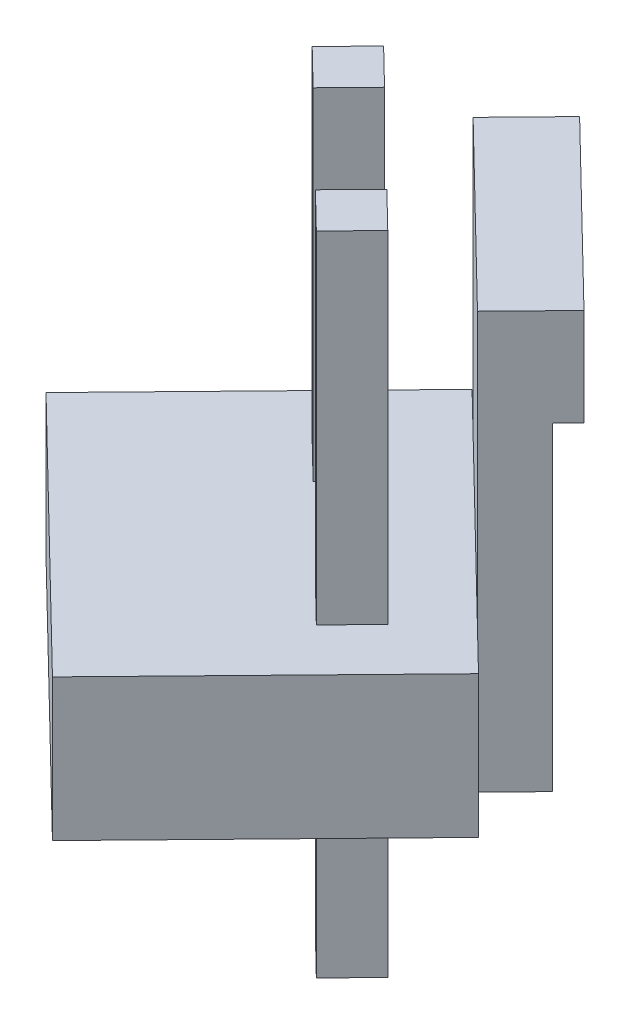
ISO-10303-21;
HEADER;
FILE_DESCRIPTION(('STEP AP214'),'2;1');
FILE_NAME('part.step','',(''),(''),'','','');
FILE_SCHEMA(('AUTOMOTIVE_DESIGN { 1 0 10303 214 1 1 1 1 }'));
ENDSEC;
DATA;
#1=APPLICATION_CONTEXT('core data for automotive mechanical design processes');
#2=APPLICATION_PROTOCOL_DEFINITION('international standard','automotive_design',2000,#1);
#3=PRODUCT_CONTEXT('',#1,'mechanical');
#4=PRODUCT('Part','Part','',(#3));
#5=PRODUCT_RELATED_PRODUCT_CATEGORY('part','',(#4));
#6=PRODUCT_DEFINITION_FORMATION('','',#4);
#7=PRODUCT_DEFINITION_CONTEXT('part definition',#1,'design');
#8=PRODUCT_DEFINITION('design','',#6,#7);
#9=PRODUCT_DEFINITION_SHAPE('','',#8);
#10=(LENGTH_UNIT() NAMED_UNIT(*) SI_UNIT(.MILLI.,.METRE.));
#11=(NAMED_UNIT(*) PLANE_ANGLE_UNIT() SI_UNIT($,.RADIAN.));
#12=(NAMED_UNIT(*) SI_UNIT($,.STERADIAN.) SOLID_ANGLE_UNIT());
#13=UNCERTAINTY_MEASURE_WITH_UNIT(LENGTH_MEASURE(1.E-05),#10,'distance_accuracy_value','');
#14=(GEOMETRIC_REPRESENTATION_CONTEXT(3) GLOBAL_UNCERTAINTY_ASSIGNED_CONTEXT((#13)) GLOBAL_UNIT_ASSIGNED_CONTEXT((#10,
#11,#12)) REPRESENTATION_CONTEXT('',''));
#15=CARTESIAN_POINT('',(0.,0.,0.));
#16=DIRECTION('',(0.,0.,1.));
#17=DIRECTION('',(1.,0.,0.));
#18=AXIS2_PLACEMENT_3D('',#15,#16,#17);
#19=CARTESIAN_POINT('',(17.0892243996113,18.8822141176223,16.4518330977177));
#20=DIRECTION('',(0.,1.,0.));
#21=DIRECTION('',(1.,0.,0.));
#22=AXIS2_PLACEMENT_3D('',#19,#20,#21);
#23=PLANE('',#22);
#24=DIRECTION('',(0.716277381432267,0.,0.697815672544359));
#25=VECTOR('',#24,1.);
#26=CARTESIAN_POINT('',(19.9151596560169,18.8822141176223,18.4091501202267));
#27=LINE('',#26,#25);
#28=CARTESIAN_POINT('',(19.9151596560169,18.8822141176222,18.4091501202268));
#29=VERTEX_POINT('',#28);
#30=CARTESIAN_POINT('',(20.7317158708497,18.8822141176222,19.2046599869274));
#31=VERTEX_POINT('',#30);
#32=EDGE_CURVE('E400',#29,#31,#27,.T.);
#33=ORIENTED_EDGE('',*,*,#32,.F.);
#34=DIRECTION('',(0.697815672544373,0.,-0.716277381432253));
#35=VECTOR('',#34,1.);
#36=CARTESIAN_POINT('',(19.1196497893164,18.8822141176223,19.2257063350596));
#37=LINE('',#36,#35);
#38=CARTESIAN_POINT('',(19.1196497893163,18.8822141176222,19.2257063350596));
#39=VERTEX_POINT('',#38);
#40=EDGE_CURVE('E371',#39,#29,#37,.T.);
#41=ORIENTED_EDGE('',*,*,#40,.F.);
#42=DIRECTION('',(-0.716277381432253,0.,-0.697815672544373));
#43=VECTOR('',#42,1.);
#44=CARTESIAN_POINT('',(19.9362060041491,18.8822141176223,20.0212162017601));
#45=LINE('',#44,#43);
#46=CARTESIAN_POINT('',(19.9362060041491,18.8822141176222,20.0212162017602));
#47=VERTEX_POINT('',#46);
#48=EDGE_CURVE('E391',#47,#39,#45,.T.);
#49=ORIENTED_EDGE('',*,*,#48,.F.);
#50=DIRECTION('',(-0.697815672544359,0.,0.716277381432267));
#51=VECTOR('',#50,1.);
#52=CARTESIAN_POINT('',(20.7317158708497,18.8822141176223,19.2046599869274));
#53=LINE('',#52,#51);
#54=EDGE_CURVE('E326',#31,#47,#53,.T.);
#55=ORIENTED_EDGE('',*,*,#54,.F.);
#56=EDGE_LOOP('',(#33,#41,#49,#55));
#57=FACE_BOUND('',#56,.T.);
#58=DIRECTION('',(-0.697815672544365,0.,0.71627738143226));
#59=VECTOR('',#58,1.);
#60=CARTESIAN_POINT('',(19.1697482210228,18.8822141176222,13.3131358156373));
#61=LINE('',#60,#59);
#62=CARTESIAN_POINT('',(18.8208403847506,18.8822141176222,13.6712745063535));
#63=VERTEX_POINT('',#62);
#64=CARTESIAN_POINT('',(17.9834615776974,18.8822141176222,14.5308073640722));
#65=VERTEX_POINT('',#64);
#66=EDGE_CURVE('E334',#63,#65,#61,.T.);
#67=ORIENTED_EDGE('',*,*,#66,.F.);
#68=DIRECTION('',(0.716277381432261,0.,0.697815672544364));
#69=VECTOR('',#68,1.);
#70=CARTESIAN_POINT('',(17.9254936579603,18.8822141176222,12.799004915673));
#71=LINE('',#70,#69);
#72=CARTESIAN_POINT('',(22.6600871492275,18.8822141176222,17.4115665111912));
#73=VERTEX_POINT('',#72);
#74=EDGE_CURVE('E487',#63,#73,#71,.T.);
#75=ORIENTED_EDGE('',*,*,#74,.T.);
#76=DIRECTION('',(0.697815672544364,0.,-0.716277381432261));
#77=VECTOR('',#76,1.);
#78=CARTESIAN_POINT('',(21.8227083421743,18.8822141176222,18.27109936891));
#79=LINE('',#78,#77);
#80=CARTESIAN_POINT('',(21.8227083421743,18.8822141176222,18.27109936891));
#81=VERTEX_POINT('',#80);
#82=EDGE_CURVE('E294',#81,#73,#79,.T.);
#83=ORIENTED_EDGE('',*,*,#82,.F.);
#84=DIRECTION('',(-0.716277381432258,0.,-0.697815672544368));
#85=VECTOR('',#84,1.);
#86=CARTESIAN_POINT('',(22.7180550689646,18.8822141176222,19.1433689595904));
#87=LINE('',#86,#85);
#88=CARTESIAN_POINT('',(22.7180550689646,18.8822141176222,19.1433689595904));
#89=VERTEX_POINT('',#88);
#90=EDGE_CURVE('E407',#89,#81,#87,.T.);
#91=ORIENTED_EDGE('',*,*,#90,.F.);
#92=DIRECTION('',(0.697815672544368,0.,-0.716277381432258));
#93=VECTOR('',#92,1.);
#94=CARTESIAN_POINT('',(17.972908495663,18.8822141176223,24.0140551533298));
#95=LINE('',#94,#93);
#96=CARTESIAN_POINT('',(17.972908495663,18.8822141176223,24.0140551533298));
#97=VERTEX_POINT('',#96);
#98=EDGE_CURVE('E535',#97,#89,#95,.T.);
#99=ORIENTED_EDGE('',*,*,#98,.F.);
#100=DIRECTION('',(0.716277381432258,0.,0.697815672544368));
#101=VECTOR('',#100,1.);
#102=CARTESIAN_POINT('',(12.3429682776054,18.8822141176223,18.529223967131));
#103=LINE('',#102,#101);
#104=CARTESIAN_POINT('',(12.3429682776054,18.8822141176223,18.529223967131));
#105=VERTEX_POINT('',#104);
#106=EDGE_CURVE('E11',#105,#97,#103,.T.);
#107=ORIENTED_EDGE('',*,*,#106,.F.);
#108=DIRECTION('',(-0.697815672544367,0.,0.716277381432258));
#109=VECTOR('',#108,1.);
#110=CARTESIAN_POINT('',(18.2744014942325,18.8822141176223,12.4408662249569));
#111=LINE('',#110,#109);
#112=CARTESIAN_POINT('',(17.0881148509071,18.8822141176223,13.6585377733917));
#113=VERTEX_POINT('',#112);
#114=EDGE_CURVE('E320',#113,#105,#111,.T.);
#115=ORIENTED_EDGE('',*,*,#114,.F.);
#116=DIRECTION('',(-0.716277381432258,0.,-0.697815672544368));
#117=VECTOR('',#116,1.);
#118=CARTESIAN_POINT('',(22.7180550689646,18.8822141176223,19.1433689595904));
#119=LINE('',#118,#117);
#120=EDGE_CURVE('E358',#65,#113,#119,.T.);
#121=ORIENTED_EDGE('',*,*,#120,.F.);
#122=EDGE_LOOP('',(#67,#75,#83,#91,#99,#107,#115,#121));
#123=FACE_BOUND('',#122,.T.);
#124=DIRECTION('',(0.716277381432267,0.,0.697815672544359));
#125=VECTOR('',#124,1.);
#126=CARTESIAN_POINT('',(19.9151596560169,18.8822141176223,18.4091501202267));
#127=LINE('',#126,#125);
#128=CARTESIAN_POINT('',(17.0787012255452,18.8822141176222,15.6458000569511));
#129=VERTEX_POINT('',#128);
#130=CARTESIAN_POINT('',(17.895257440378,18.8822141176223,16.4413099236516));
#131=VERTEX_POINT('',#130);
#132=EDGE_CURVE('E254',#129,#131,#127,.T.);
#133=ORIENTED_EDGE('',*,*,#132,.F.);
#134=DIRECTION('',(0.697815672544372,0.,-0.716277381432254));
#135=VECTOR('',#134,1.);
#136=CARTESIAN_POINT('',(16.2831913588446,18.8822141176223,16.4623562717838));
#137=LINE('',#136,#135);
#138=CARTESIAN_POINT('',(16.2831913588446,18.8822141176223,16.4623562717838));
#139=VERTEX_POINT('',#138);
#140=EDGE_CURVE('E305',#139,#129,#137,.T.);
#141=ORIENTED_EDGE('',*,*,#140,.F.);
#142=DIRECTION('',(-0.716277381432253,0.,-0.697815672544373));
#143=VECTOR('',#142,1.);
#144=CARTESIAN_POINT('',(19.9362060041491,18.8822141176223,20.0212162017601));
#145=LINE('',#144,#143);
#146=CARTESIAN_POINT('',(17.0997475736774,18.8822141176222,17.2578661384844));
#147=VERTEX_POINT('',#146);
#148=EDGE_CURVE('E278',#147,#139,#145,.T.);
#149=ORIENTED_EDGE('',*,*,#148,.F.);
#150=DIRECTION('',(-0.697815672544368,0.,0.716277381432258));
#151=VECTOR('',#150,1.);
#152=CARTESIAN_POINT('',(17.895257440378,18.8822141176223,16.4413099236516));
#153=LINE('',#152,#151);
#154=EDGE_CURVE('E270',#131,#147,#153,.T.);
#155=ORIENTED_EDGE('',*,*,#154,.F.);
#156=EDGE_LOOP('',(#133,#141,#149,#155));
#157=FACE_BOUND('',#156,.T.);
#158=ADVANCED_FACE('F18',(#57,#123,#157),#23,.F.);
#159=CARTESIAN_POINT('',(17.0892243996113,22.0822141176222,16.4518330977177));
#160=DIRECTION('',(0.,1.,0.));
#161=DIRECTION('',(1.,0.,0.));
#162=AXIS2_PLACEMENT_3D('',#159,#160,#161);
#163=PLANE('',#162);
#164=DIRECTION('',(0.716277381432258,0.,0.697815672544368));
#165=VECTOR('',#164,1.);
#166=CARTESIAN_POINT('',(22.7180550689646,22.0822141176222,19.1433689595905));
#167=LINE('',#166,#165);
#168=CARTESIAN_POINT('',(17.9834615776974,22.0822141176222,14.5308073640722));
#169=VERTEX_POINT('',#168);
#170=CARTESIAN_POINT('',(21.8227083421743,22.0822141176222,18.27109936891));
#171=VERTEX_POINT('',#170);
#172=EDGE_CURVE('E348',#169,#171,#167,.T.);
#173=ORIENTED_EDGE('',*,*,#172,.F.);
#174=DIRECTION('',(-0.716277381432258,0.,-0.697815672544368));
#175=VECTOR('',#174,1.);
#176=CARTESIAN_POINT('',(18.4848557446999,22.0822141176222,15.0192783348532));
#177=LINE('',#176,#175);
#178=CARTESIAN_POINT('',(17.088114850907,22.0822141176222,13.6585377733917));
#179=VERTEX_POINT('',#178);
#180=EDGE_CURVE('E403',#169,#179,#177,.T.);
#181=ORIENTED_EDGE('',*,*,#180,.T.);
#182=DIRECTION('',(-0.697815672544367,0.,0.716277381432258));
#183=VECTOR('',#182,1.);
#184=CARTESIAN_POINT('',(18.2744014942325,22.0822141176222,12.4408662249569));
#185=LINE('',#184,#183);
#186=CARTESIAN_POINT('',(12.3429682776054,22.0822141176222,18.529223967131));
#187=VERTEX_POINT('',#186);
#188=EDGE_CURVE('E319',#179,#187,#185,.T.);
#189=ORIENTED_EDGE('',*,*,#188,.T.);
#190=DIRECTION('',(0.716277381432258,0.,0.697815672544368));
#191=VECTOR('',#190,1.);
#192=CARTESIAN_POINT('',(12.3429682776054,22.0822141176222,18.529223967131));
#193=LINE('',#192,#191);
#194=CARTESIAN_POINT('',(17.972908495663,22.0822141176222,24.0140551533298));
#195=VERTEX_POINT('',#194);
#196=EDGE_CURVE('E21',#187,#195,#193,.T.);
#197=ORIENTED_EDGE('',*,*,#196,.T.);
#198=DIRECTION('',(0.697815672544368,0.,-0.716277381432258));
#199=VECTOR('',#198,1.);
#200=CARTESIAN_POINT('',(17.972908495663,22.0822141176222,24.0140551533298));
#201=LINE('',#200,#199);
#202=CARTESIAN_POINT('',(22.7180550689646,22.0822141176222,19.1433689595905));
#203=VERTEX_POINT('',#202);
#204=EDGE_CURVE('E293',#195,#203,#201,.T.);
#205=ORIENTED_EDGE('',*,*,#204,.T.);
#206=DIRECTION('',(-0.716277381432258,0.,-0.697815672544368));
#207=VECTOR('',#206,1.);
#208=CARTESIAN_POINT('',(22.7180550689646,22.0822141176222,19.1433689595905));
#209=LINE('',#208,#207);
#210=EDGE_CURVE('E521',#203,#171,#209,.T.);
#211=ORIENTED_EDGE('',*,*,#210,.T.);
#212=EDGE_LOOP('',(#173,#181,#189,#197,#205,#211));
#213=FACE_BOUND('',#212,.T.);
#214=DIRECTION('',(-0.716277381432267,0.,-0.697815672544359));
#215=VECTOR('',#214,1.);
#216=CARTESIAN_POINT('',(19.9151596560169,22.0822141176222,18.4091501202267));
#217=LINE('',#216,#215);
#218=CARTESIAN_POINT('',(20.7317158708497,22.0822141176222,19.2046599869274));
#219=VERTEX_POINT('',#218);
#220=CARTESIAN_POINT('',(19.9151596560169,22.0822141176222,18.4091501202267));
#221=VERTEX_POINT('',#220);
#222=EDGE_CURVE('E457',#219,#221,#217,.T.);
#223=ORIENTED_EDGE('',*,*,#222,.F.);
#224=DIRECTION('',(0.697815672544359,0.,-0.716277381432267));
#225=VECTOR('',#224,1.);
#226=CARTESIAN_POINT('',(20.7317158708497,22.0822141176222,19.2046599869274));
#227=LINE('',#226,#225);
#228=CARTESIAN_POINT('',(19.9362060041491,22.0822141176222,20.0212162017601));
#229=VERTEX_POINT('',#228);
#230=EDGE_CURVE('E464',#229,#219,#227,.T.);
#231=ORIENTED_EDGE('',*,*,#230,.F.);
#232=DIRECTION('',(0.716277381432253,0.,0.697815672544373));
#233=VECTOR('',#232,1.);
#234=CARTESIAN_POINT('',(19.9362060041491,22.0822141176222,20.0212162017601));
#235=LINE('',#234,#233);
#236=CARTESIAN_POINT('',(19.1196497893164,22.0822141176222,19.2257063350596));
#237=VERTEX_POINT('',#236);
#238=EDGE_CURVE('E299',#237,#229,#235,.T.);
#239=ORIENTED_EDGE('',*,*,#238,.F.);
#240=DIRECTION('',(-0.697815672544373,0.,0.716277381432253));
#241=VECTOR('',#240,1.);
#242=CARTESIAN_POINT('',(19.1196497893164,22.0822141176222,19.2257063350596));
#243=LINE('',#242,#241);
#244=EDGE_CURVE('E443',#221,#237,#243,.T.);
#245=ORIENTED_EDGE('',*,*,#244,.F.);
#246=EDGE_LOOP('',(#223,#231,#239,#245));
#247=FACE_BOUND('',#246,.T.);
#248=DIRECTION('',(-0.716277381432267,0.,-0.697815672544359));
#249=VECTOR('',#248,1.);
#250=CARTESIAN_POINT('',(19.9151596560169,22.0822141176222,18.4091501202267));
#251=LINE('',#250,#249);
#252=CARTESIAN_POINT('',(17.895257440378,22.0822141176222,16.4413099236516));
#253=VERTEX_POINT('',#252);
#254=CARTESIAN_POINT('',(17.0787012255452,22.0822141176222,15.6458000569511));
#255=VERTEX_POINT('',#254);
#256=EDGE_CURVE('E422',#253,#255,#251,.T.);
#257=ORIENTED_EDGE('',*,*,#256,.F.);
#258=DIRECTION('',(0.697815672544368,0.,-0.716277381432258));
#259=VECTOR('',#258,1.);
#260=CARTESIAN_POINT('',(17.895257440378,22.0822141176222,16.4413099236516));
#261=LINE('',#260,#259);
#262=CARTESIAN_POINT('',(17.0997475736774,22.0822141176222,17.2578661384844));
#263=VERTEX_POINT('',#262);
#264=EDGE_CURVE('E380',#263,#253,#261,.T.);
#265=ORIENTED_EDGE('',*,*,#264,.F.);
#266=DIRECTION('',(0.716277381432253,0.,0.697815672544373));
#267=VECTOR('',#266,1.);
#268=CARTESIAN_POINT('',(19.9362060041491,22.0822141176222,20.0212162017601));
#269=LINE('',#268,#267);
#270=CARTESIAN_POINT('',(16.2831913588446,22.0822141176222,16.4623562717838));
#271=VERTEX_POINT('',#270);
#272=EDGE_CURVE('E289',#271,#263,#269,.T.);
#273=ORIENTED_EDGE('',*,*,#272,.F.);
#274=DIRECTION('',(-0.697815672544372,0.,0.716277381432254));
#275=VECTOR('',#274,1.);
#276=CARTESIAN_POINT('',(16.2831913588446,22.0822141176222,16.4623562717838));
#277=LINE('',#276,#275);
#278=EDGE_CURVE('E363',#255,#271,#277,.T.);
#279=ORIENTED_EDGE('',*,*,#278,.F.);
#280=EDGE_LOOP('',(#257,#265,#273,#279));
#281=FACE_BOUND('',#280,.T.);
#282=ADVANCED_FACE('F544',(#213,#247,#281),#163,.T.);
#283=CARTESIAN_POINT('',(12.3429682776054,18.8822141176223,18.529223967131));
#284=DIRECTION('',(-0.697815672544368,0.,0.716277381432258));
#285=DIRECTION('',(0.,1.,0.));
#286=AXIS2_PLACEMENT_3D('',#283,#284,#285);
#287=PLANE('',#286);
#288=ORIENTED_EDGE('',*,*,#196,.F.);
#289=DIRECTION('',(0.,1.,0.));
#290=VECTOR('',#289,1.);
#291=CARTESIAN_POINT('',(12.3429682776054,18.8822141176223,18.529223967131));
#292=LINE('',#291,#290);
#293=EDGE_CURVE('E315',#105,#187,#292,.T.);
#294=ORIENTED_EDGE('',*,*,#293,.F.);
#295=ORIENTED_EDGE('',*,*,#106,.T.);
#296=DIRECTION('',(0.,1.,0.));
#297=VECTOR('',#296,1.);
#298=CARTESIAN_POINT('',(17.972908495663,18.8822141176223,24.0140551533298));
#299=LINE('',#298,#297);
#300=EDGE_CURVE('E532',#97,#195,#299,.T.);
#301=ORIENTED_EDGE('',*,*,#300,.T.);
#302=EDGE_LOOP('',(#288,#294,#295,#301));
#303=FACE_BOUND('',#302,.T.);
#304=ADVANCED_FACE('F549',(#303),#287,.T.);
#305=CARTESIAN_POINT('',(18.2744014942325,18.8822141176223,12.4408662249569));
#306=DIRECTION('',(-0.716277381432258,0.,-0.697815672544367));
#307=DIRECTION('',(-0.697815672544367,0.,0.716277381432258));
#308=AXIS2_PLACEMENT_3D('',#305,#306,#307);
#309=PLANE('',#308);
#310=DIRECTION('',(0.,-1.,0.));
#311=VECTOR('',#310,1.);
#312=CARTESIAN_POINT('',(17.088114850907,18.8822141176223,13.6585377733917));
#313=LINE('',#312,#311);
#314=EDGE_CURVE('E408',#179,#113,#313,.T.);
#315=ORIENTED_EDGE('',*,*,#314,.T.);
#316=ORIENTED_EDGE('',*,*,#114,.T.);
#317=ORIENTED_EDGE('',*,*,#293,.T.);
#318=ORIENTED_EDGE('',*,*,#188,.F.);
#319=EDGE_LOOP('',(#315,#316,#317,#318));
#320=FACE_BOUND('',#319,.T.);
#321=ADVANCED_FACE('F570',(#320),#309,.T.);
#322=CARTESIAN_POINT('',(23.9043417122901,18.8822141176223,17.9256974111556));
#323=DIRECTION('',(0.697815672544368,0.,-0.716277381432258));
#324=DIRECTION('',(0.,-1.,0.));
#325=AXIS2_PLACEMENT_3D('',#322,#323,#324);
#326=PLANE('',#325);
#327=DIRECTION('',(0.716277381432261,0.,0.697815672544364));
#328=VECTOR('',#327,1.);
#329=CARTESIAN_POINT('',(18.2744014942325,26.0822141176222,12.4408662249568));
#330=LINE('',#329,#328);
#331=CARTESIAN_POINT('',(19.1697482210228,26.0822141176222,13.3131358156373));
#332=VERTEX_POINT('',#331);
#333=CARTESIAN_POINT('',(23.0089949854997,26.0822141176222,17.0534278204752));
#334=VERTEX_POINT('',#333);
#335=EDGE_CURVE('E467',#332,#334,#330,.T.);
#336=ORIENTED_EDGE('',*,*,#335,.F.);
#337=DIRECTION('',(0.,-1.,0.));
#338=VECTOR('',#337,1.);
#339=CARTESIAN_POINT('',(19.1697482210228,22.0822141176222,13.3131358156373));
#340=LINE('',#339,#338);
#341=CARTESIAN_POINT('',(19.1697482210228,28.2822141176222,13.3131358156373));
#342=VERTEX_POINT('',#341);
#343=EDGE_CURVE('E355',#342,#332,#340,.T.);
#344=ORIENTED_EDGE('',*,*,#343,.F.);
#345=DIRECTION('',(-0.716277381432258,0.,-0.697815672544367));
#346=VECTOR('',#345,1.);
#347=CARTESIAN_POINT('',(19.1697482210228,28.2822141176222,13.3131358156373));
#348=LINE('',#347,#346);
#349=CARTESIAN_POINT('',(23.0089949854997,28.2822141176222,17.0534278204752));
#350=VERTEX_POINT('',#349);
#351=EDGE_CURVE('E498',#350,#342,#348,.T.);
#352=ORIENTED_EDGE('',*,*,#351,.F.);
#353=DIRECTION('',(0.,-1.,0.));
#354=VECTOR('',#353,1.);
#355=CARTESIAN_POINT('',(23.0089949854997,22.0822141176222,17.0534278204752));
#356=LINE('',#355,#354);
#357=EDGE_CURVE('E291',#350,#334,#356,.T.);
#358=ORIENTED_EDGE('',*,*,#357,.T.);
#359=EDGE_LOOP('',(#336,#344,#352,#358));
#360=FACE_BOUND('',#359,.T.);
#361=ADVANCED_FACE('F644',(#360),#326,.T.);
#362=CARTESIAN_POINT('',(17.972908495663,18.8822141176223,24.0140551533298));
#363=DIRECTION('',(0.716277381432258,0.,0.697815672544368));
#364=DIRECTION('',(0.,-1.,0.));
#365=AXIS2_PLACEMENT_3D('',#362,#363,#364);
#366=PLANE('',#365);
#367=DIRECTION('',(0.,-1.,0.));
#368=VECTOR('',#367,1.);
#369=CARTESIAN_POINT('',(22.7180550689646,22.0822141176222,19.1433689595905));
#370=LINE('',#369,#368);
#371=EDGE_CURVE('E524',#203,#89,#370,.T.);
#372=ORIENTED_EDGE('',*,*,#371,.F.);
#373=ORIENTED_EDGE('',*,*,#204,.F.);
#374=ORIENTED_EDGE('',*,*,#300,.F.);
#375=ORIENTED_EDGE('',*,*,#98,.T.);
#376=EDGE_LOOP('',(#372,#373,#374,#375));
#377=FACE_BOUND('',#376,.T.);
#378=ADVANCED_FACE('F551',(#377),#366,.T.);
#379=CARTESIAN_POINT('',(21.8227083421743,22.0822141176222,18.27109936891));
#380=DIRECTION('',(-0.716277381432261,0.,-0.697815672544364));
#381=DIRECTION('',(-0.697815672544364,0.,0.716277381432261));
#382=AXIS2_PLACEMENT_3D('',#379,#380,#381);
#383=PLANE('',#382);
#384=ORIENTED_EDGE('',*,*,#82,.T.);
#385=DIRECTION('',(0.,-1.,0.));
#386=VECTOR('',#385,1.);
#387=CARTESIAN_POINT('',(22.6600871492275,26.0822141176222,17.4115665111912));
#388=LINE('',#387,#386);
#389=CARTESIAN_POINT('',(22.6600871492275,26.0822141176222,17.4115665111912));
#390=VERTEX_POINT('',#389);
#391=EDGE_CURVE('E483',#390,#73,#388,.T.);
#392=ORIENTED_EDGE('',*,*,#391,.F.);
#393=DIRECTION('',(-0.697815672544364,0.,0.716277381432261));
#394=VECTOR('',#393,1.);
#395=CARTESIAN_POINT('',(23.0089949854997,26.0822141176222,17.0534278204752));
#396=LINE('',#395,#394);
#397=EDGE_CURVE('E468',#334,#390,#396,.T.);
#398=ORIENTED_EDGE('',*,*,#397,.F.);
#399=ORIENTED_EDGE('',*,*,#357,.F.);
#400=DIRECTION('',(0.69781567254437,0.,-0.716277381432256));
#401=VECTOR('',#400,1.);
#402=CARTESIAN_POINT('',(23.0089949854997,28.2822141176222,17.0534278204752));
#403=LINE('',#402,#401);
#404=CARTESIAN_POINT('',(21.8227083421744,28.2822141176222,18.27109936891));
#405=VERTEX_POINT('',#404);
#406=EDGE_CURVE('E344',#405,#350,#403,.T.);
#407=ORIENTED_EDGE('',*,*,#406,.F.);
#408=DIRECTION('',(0.,-1.,0.));
#409=VECTOR('',#408,1.);
#410=CARTESIAN_POINT('',(21.8227083421743,22.0822141176222,18.27109936891));
#411=LINE('',#410,#409);
#412=EDGE_CURVE('E379',#405,#171,#411,.T.);
#413=ORIENTED_EDGE('',*,*,#412,.T.);
#414=DIRECTION('',(0.,-1.,0.));
#415=VECTOR('',#414,1.);
#416=CARTESIAN_POINT('',(21.8227083421743,22.0822141176222,18.27109936891));
#417=LINE('',#416,#415);
#418=EDGE_CURVE('E502',#171,#81,#417,.T.);
#419=ORIENTED_EDGE('',*,*,#418,.T.);
#420=EDGE_LOOP('',(#384,#392,#398,#399,#407,#413,#419));
#421=FACE_BOUND('',#420,.T.);
#422=ADVANCED_FACE('F638',(#421),#383,.F.);
#423=CARTESIAN_POINT('',(22.7180550689646,22.0822141176222,19.1433689595905));
#424=DIRECTION('',(-0.697815672544368,0.,0.716277381432258));
#425=DIRECTION('',(0.,1.,0.));
#426=AXIS2_PLACEMENT_3D('',#423,#424,#425);
#427=PLANE('',#426);
#428=ORIENTED_EDGE('',*,*,#90,.T.);
#429=ORIENTED_EDGE('',*,*,#418,.F.);
#430=ORIENTED_EDGE('',*,*,#210,.F.);
#431=ORIENTED_EDGE('',*,*,#371,.T.);
#432=EDGE_LOOP('',(#428,#429,#430,#431));
#433=FACE_BOUND('',#432,.T.);
#434=ADVANCED_FACE('F556',(#433),#427,.F.);
#435=CARTESIAN_POINT('',(22.7180550689646,22.0822141176222,19.1433689595905));
#436=DIRECTION('',(-0.697815672544368,0.,0.716277381432258));
#437=DIRECTION('',(0.,1.,0.));
#438=AXIS2_PLACEMENT_3D('',#435,#436,#437);
#439=PLANE('',#438);
#440=ORIENTED_EDGE('',*,*,#120,.T.);
#441=ORIENTED_EDGE('',*,*,#314,.F.);
#442=ORIENTED_EDGE('',*,*,#180,.F.);
#443=DIRECTION('',(0.,-1.,0.));
#444=VECTOR('',#443,1.);
#445=CARTESIAN_POINT('',(17.9834615776974,22.0822141176222,14.5308073640722));
#446=LINE('',#445,#444);
#447=EDGE_CURVE('E338',#169,#65,#446,.T.);
#448=ORIENTED_EDGE('',*,*,#447,.T.);
#449=EDGE_LOOP('',(#440,#441,#442,#448));
#450=FACE_BOUND('',#449,.T.);
#451=ADVANCED_FACE('F567',(#450),#439,.F.);
#452=CARTESIAN_POINT('',(19.1697482210228,22.0822141176222,13.3131358156373));
#453=DIRECTION('',(0.71627738143226,0.,0.697815672544365));
#454=DIRECTION('',(0.,-1.,0.));
#455=AXIS2_PLACEMENT_3D('',#452,#453,#454);
#456=PLANE('',#455);
#457=DIRECTION('',(-0.697815672544365,0.,0.71627738143226));
#458=VECTOR('',#457,1.);
#459=CARTESIAN_POINT('',(19.169748221023,26.0822141176222,13.3131358156372));
#460=LINE('',#459,#458);
#461=CARTESIAN_POINT('',(18.8208403847506,26.0822141176222,13.6712745063535));
#462=VERTEX_POINT('',#461);
#463=EDGE_CURVE('E479',#332,#462,#460,.T.);
#464=ORIENTED_EDGE('',*,*,#463,.T.);
#465=DIRECTION('',(0.,-1.,0.));
#466=VECTOR('',#465,1.);
#467=CARTESIAN_POINT('',(18.8208403847506,22.0822141176222,13.6712745063535));
#468=LINE('',#467,#466);
#469=EDGE_CURVE('E491',#462,#63,#468,.T.);
#470=ORIENTED_EDGE('',*,*,#469,.T.);
#471=ORIENTED_EDGE('',*,*,#66,.T.);
#472=ORIENTED_EDGE('',*,*,#447,.F.);
#473=DIRECTION('',(0.,-1.,0.));
#474=VECTOR('',#473,1.);
#475=CARTESIAN_POINT('',(17.9834615776974,22.0822141176222,14.5308073640722));
#476=LINE('',#475,#474);
#477=CARTESIAN_POINT('',(17.9834615776975,28.2822141176222,14.5308073640722));
#478=VERTEX_POINT('',#477);
#479=EDGE_CURVE('E339',#478,#169,#476,.T.);
#480=ORIENTED_EDGE('',*,*,#479,.F.);
#481=DIRECTION('',(-0.697815672544367,0.,0.716277381432258));
#482=VECTOR('',#481,1.);
#483=CARTESIAN_POINT('',(17.9834615776975,28.2822141176222,14.5308073640722));
#484=LINE('',#483,#482);
#485=EDGE_CURVE('E450',#342,#478,#484,.T.);
#486=ORIENTED_EDGE('',*,*,#485,.F.);
#487=ORIENTED_EDGE('',*,*,#343,.T.);
#488=EDGE_LOOP('',(#464,#470,#471,#472,#480,#486,#487));
#489=FACE_BOUND('',#488,.T.);
#490=ADVANCED_FACE('F565',(#489),#456,.F.);
#491=CARTESIAN_POINT('',(22.7180550689646,22.0822141176222,19.1433689595905));
#492=DIRECTION('',(-0.697815672544368,0.,0.716277381432258));
#493=DIRECTION('',(0.,1.,0.));
#494=AXIS2_PLACEMENT_3D('',#491,#492,#493);
#495=PLANE('',#494);
#496=ORIENTED_EDGE('',*,*,#172,.T.);
#497=ORIENTED_EDGE('',*,*,#412,.F.);
#498=DIRECTION('',(0.716277381432258,0.,0.697815672544368));
#499=VECTOR('',#498,1.);
#500=CARTESIAN_POINT('',(18.4848557446999,28.2822141176222,15.0192783348532));
#501=LINE('',#500,#499);
#502=EDGE_CURVE('E349',#478,#405,#501,.T.);
#503=ORIENTED_EDGE('',*,*,#502,.F.);
#504=ORIENTED_EDGE('',*,*,#479,.T.);
#505=EDGE_LOOP('',(#496,#497,#503,#504));
#506=FACE_BOUND('',#505,.T.);
#507=ADVANCED_FACE('F559',(#506),#495,.T.);
#508=CARTESIAN_POINT('',(17.0892243996113,28.2822141176222,16.4518330977177));
#509=DIRECTION('',(0.,-1.,0.));
#510=DIRECTION('',(0.,0.,-1.));
#511=AXIS2_PLACEMENT_3D('',#508,#509,#510);
#512=PLANE('',#511);
#513=ORIENTED_EDGE('',*,*,#351,.T.);
#514=ORIENTED_EDGE('',*,*,#485,.T.);
#515=ORIENTED_EDGE('',*,*,#502,.T.);
#516=ORIENTED_EDGE('',*,*,#406,.T.);
#517=EDGE_LOOP('',(#513,#514,#515,#516));
#518=FACE_BOUND('',#517,.T.);
#519=ADVANCED_FACE('F641',(#518),#512,.F.);
#520=CARTESIAN_POINT('',(17.9254936579603,26.0822141176222,12.799004915673));
#521=DIRECTION('',(-0.697815672544364,0.,0.716277381432261));
#522=DIRECTION('',(0.,1.,0.));
#523=AXIS2_PLACEMENT_3D('',#520,#521,#522);
#524=PLANE('',#523);
#525=DIRECTION('',(0.716277381432261,0.,0.697815672544364));
#526=VECTOR('',#525,1.);
#527=CARTESIAN_POINT('',(17.9254936579603,26.0822141176222,12.799004915673));
#528=LINE('',#527,#526);
#529=EDGE_CURVE('E472',#462,#390,#528,.T.);
#530=ORIENTED_EDGE('',*,*,#529,.T.);
#531=ORIENTED_EDGE('',*,*,#391,.T.);
#532=ORIENTED_EDGE('',*,*,#74,.F.);
#533=ORIENTED_EDGE('',*,*,#469,.F.);
#534=EDGE_LOOP('',(#530,#531,#532,#533));
#535=FACE_BOUND('',#534,.T.);
#536=ADVANCED_FACE('F635',(#535),#524,.F.);
#537=CARTESIAN_POINT('',(18.2744014942325,26.0822141176222,12.4408662249568));
#538=DIRECTION('',(0.,1.,0.));
#539=DIRECTION('',(1.,0.,0.));
#540=AXIS2_PLACEMENT_3D('',#537,#538,#539);
#541=PLANE('',#540);
#542=ORIENTED_EDGE('',*,*,#335,.T.);
#543=ORIENTED_EDGE('',*,*,#397,.T.);
#544=ORIENTED_EDGE('',*,*,#529,.F.);
#545=ORIENTED_EDGE('',*,*,#463,.F.);
#546=EDGE_LOOP('',(#542,#543,#544,#545));
#547=FACE_BOUND('',#546,.T.);
#548=ADVANCED_FACE('F646',(#547),#541,.F.);
#549=CARTESIAN_POINT('',(20.7317158708497,29.7822141176222,19.2046599869274));
#550=DIRECTION('',(-0.716277381432267,0.,-0.697815672544359));
#551=DIRECTION('',(-0.697815672544359,0.,0.716277381432267));
#552=AXIS2_PLACEMENT_3D('',#549,#550,#551);
#553=PLANE('',#552);
#554=ORIENTED_EDGE('',*,*,#230,.T.);
#555=DIRECTION('',(0.,-1.,0.));
#556=VECTOR('',#555,1.);
#557=CARTESIAN_POINT('',(20.7317158708497,29.7822141176222,19.2046599869274));
#558=LINE('',#557,#556);
#559=CARTESIAN_POINT('',(20.7317158708497,29.7822141176222,19.2046599869274));
#560=VERTEX_POINT('',#559);
#561=EDGE_CURVE('E460',#560,#219,#558,.T.);
#562=ORIENTED_EDGE('',*,*,#561,.F.);
#563=DIRECTION('',(0.697815672544359,0.,-0.716277381432267));
#564=VECTOR('',#563,1.);
#565=CARTESIAN_POINT('',(20.7317158708497,29.7822141176222,19.2046599869274));
#566=LINE('',#565,#564);
#567=CARTESIAN_POINT('',(19.9362060041491,29.7822141176222,20.0212162017601));
#568=VERTEX_POINT('',#567);
#569=EDGE_CURVE('E325',#568,#560,#566,.T.);
#570=ORIENTED_EDGE('',*,*,#569,.F.);
#571=DIRECTION('',(0.,-1.,0.));
#572=VECTOR('',#571,1.);
#573=CARTESIAN_POINT('',(19.9362060041491,29.7822141176222,20.0212162017601));
#574=LINE('',#573,#572);
#575=EDGE_CURVE('E435',#568,#229,#574,.T.);
#576=ORIENTED_EDGE('',*,*,#575,.T.);
#577=EDGE_LOOP('',(#554,#562,#570,#576));
#578=FACE_BOUND('',#577,.T.);
#579=ADVANCED_FACE('F648',(#578),#553,.F.);
#580=CARTESIAN_POINT('',(19.9151596560169,29.7822141176222,18.4091501202267));
#581=DIRECTION('',(-0.697815672544359,0.,0.716277381432267));
#582=DIRECTION('',(0.,1.,0.));
#583=AXIS2_PLACEMENT_3D('',#580,#581,#582);
#584=PLANE('',#583);
#585=ORIENTED_EDGE('',*,*,#222,.T.);
#586=DIRECTION('',(0.,-1.,0.));
#587=VECTOR('',#586,1.);
#588=CARTESIAN_POINT('',(19.9151596560169,29.7822141176222,18.4091501202267));
#589=LINE('',#588,#587);
#590=CARTESIAN_POINT('',(19.9151596560169,29.7822141176222,18.4091501202267));
#591=VERTEX_POINT('',#590);
#592=EDGE_CURVE('E453',#591,#221,#589,.T.);
#593=ORIENTED_EDGE('',*,*,#592,.F.);
#594=DIRECTION('',(-0.716277381432267,0.,-0.697815672544359));
#595=VECTOR('',#594,1.);
#596=CARTESIAN_POINT('',(19.9151596560169,29.7822141176222,18.4091501202267));
#597=LINE('',#596,#595);
#598=EDGE_CURVE('E321',#560,#591,#597,.T.);
#599=ORIENTED_EDGE('',*,*,#598,.F.);
#600=ORIENTED_EDGE('',*,*,#561,.T.);
#601=EDGE_LOOP('',(#585,#593,#599,#600));
#602=FACE_BOUND('',#601,.T.);
#603=ADVANCED_FACE('F654',(#602),#584,.F.);
#604=CARTESIAN_POINT('',(19.1196497893164,29.7822141176222,19.2257063350596));
#605=DIRECTION('',(0.716277381432253,0.,0.697815672544373));
#606=DIRECTION('',(0.,-1.,0.));
#607=AXIS2_PLACEMENT_3D('',#604,#605,#606);
#608=PLANE('',#607);
#609=ORIENTED_EDGE('',*,*,#244,.T.);
#610=DIRECTION('',(0.,-1.,0.));
#611=VECTOR('',#610,1.);
#612=CARTESIAN_POINT('',(19.1196497893164,29.7822141176222,19.2257063350596));
#613=LINE('',#612,#611);
#614=CARTESIAN_POINT('',(19.1196497893164,29.7822141176222,19.2257063350596));
#615=VERTEX_POINT('',#614);
#616=EDGE_CURVE('E439',#615,#237,#613,.T.);
#617=ORIENTED_EDGE('',*,*,#616,.F.);
#618=DIRECTION('',(-0.697815672544373,0.,0.716277381432253));
#619=VECTOR('',#618,1.);
#620=CARTESIAN_POINT('',(19.1196497893164,29.7822141176222,19.2257063350596));
#621=LINE('',#620,#619);
#622=EDGE_CURVE('E300',#591,#615,#621,.T.);
#623=ORIENTED_EDGE('',*,*,#622,.F.);
#624=ORIENTED_EDGE('',*,*,#592,.T.);
#625=EDGE_LOOP('',(#609,#617,#623,#624));
#626=FACE_BOUND('',#625,.T.);
#627=ADVANCED_FACE('F700',(#626),#608,.F.);
#628=CARTESIAN_POINT('',(19.9362060041491,29.7822141176222,20.0212162017601));
#629=DIRECTION('',(0.697815672544373,0.,-0.716277381432253));
#630=DIRECTION('',(0.,-1.,0.));
#631=AXIS2_PLACEMENT_3D('',#628,#629,#630);
#632=PLANE('',#631);
#633=ORIENTED_EDGE('',*,*,#238,.T.);
#634=ORIENTED_EDGE('',*,*,#575,.F.);
#635=DIRECTION('',(0.716277381432253,0.,0.697815672544373));
#636=VECTOR('',#635,1.);
#637=CARTESIAN_POINT('',(19.9362060041491,29.7822141176222,20.0212162017601));
#638=LINE('',#637,#636);
#639=EDGE_CURVE('E295',#615,#568,#638,.T.);
#640=ORIENTED_EDGE('',*,*,#639,.F.);
#641=ORIENTED_EDGE('',*,*,#616,.T.);
#642=EDGE_LOOP('',(#633,#634,#640,#641));
#643=FACE_BOUND('',#642,.T.);
#644=ADVANCED_FACE('F663',(#643),#632,.F.);
#645=CARTESIAN_POINT('',(17.0892243996113,29.7822141176222,16.4518330977177));
#646=DIRECTION('',(0.,-1.,0.));
#647=DIRECTION('',(0.,0.,-1.));
#648=AXIS2_PLACEMENT_3D('',#645,#646,#647);
#649=PLANE('',#648);
#650=ORIENTED_EDGE('',*,*,#569,.T.);
#651=ORIENTED_EDGE('',*,*,#598,.T.);
#652=ORIENTED_EDGE('',*,*,#622,.T.);
#653=ORIENTED_EDGE('',*,*,#639,.T.);
#654=EDGE_LOOP('',(#650,#651,#652,#653));
#655=FACE_BOUND('',#654,.T.);
#656=ADVANCED_FACE('F659',(#655),#649,.F.);
#657=CARTESIAN_POINT('',(17.895257440378,29.7822141176222,16.4413099236516));
#658=DIRECTION('',(-0.716277381432258,0.,-0.697815672544368));
#659=DIRECTION('',(-0.697815672544368,0.,0.716277381432258));
#660=AXIS2_PLACEMENT_3D('',#657,#658,#659);
#661=PLANE('',#660);
#662=ORIENTED_EDGE('',*,*,#264,.T.);
#663=DIRECTION('',(0.,-1.,0.));
#664=VECTOR('',#663,1.);
#665=CARTESIAN_POINT('',(17.8952574403779,29.7822141176222,16.4413099236517));
#666=LINE('',#665,#664);
#667=CARTESIAN_POINT('',(17.895257440378,29.7822141176222,16.4413099236516));
#668=VERTEX_POINT('',#667);
#669=EDGE_CURVE('E383',#668,#253,#666,.T.);
#670=ORIENTED_EDGE('',*,*,#669,.F.);
#671=DIRECTION('',(0.697815672544368,0.,-0.716277381432258));
#672=VECTOR('',#671,1.);
#673=CARTESIAN_POINT('',(17.895257440378,29.7822141176222,16.4413099236516));
#674=LINE('',#673,#672);
#675=CARTESIAN_POINT('',(17.0997475736774,29.7822141176222,17.2578661384844));
#676=VERTEX_POINT('',#675);
#677=EDGE_CURVE('E342',#676,#668,#674,.T.);
#678=ORIENTED_EDGE('',*,*,#677,.F.);
#679=DIRECTION('',(0.,-1.,0.));
#680=VECTOR('',#679,1.);
#681=CARTESIAN_POINT('',(17.0997475736774,29.7822141176222,17.2578661384844));
#682=LINE('',#681,#680);
#683=EDGE_CURVE('E364',#676,#263,#682,.T.);
#684=ORIENTED_EDGE('',*,*,#683,.T.);
#685=EDGE_LOOP('',(#662,#670,#678,#684));
#686=FACE_BOUND('',#685,.T.);
#687=ADVANCED_FACE('F662',(#686),#661,.F.);
#688=CARTESIAN_POINT('',(19.9151596560169,29.7822141176222,18.4091501202267));
#689=DIRECTION('',(-0.697815672544359,0.,0.716277381432267));
#690=DIRECTION('',(0.,1.,0.));
#691=AXIS2_PLACEMENT_3D('',#688,#689,#690);
#692=PLANE('',#691);
#693=ORIENTED_EDGE('',*,*,#256,.T.);
#694=DIRECTION('',(0.,-1.,0.));
#695=VECTOR('',#694,1.);
#696=CARTESIAN_POINT('',(17.0787012255452,29.7822141176222,15.6458000569511));
#697=LINE('',#696,#695);
#698=CARTESIAN_POINT('',(17.0787012255452,29.7822141176222,15.6458000569511));
#699=VERTEX_POINT('',#698);
#700=EDGE_CURVE('E418',#699,#255,#697,.T.);
#701=ORIENTED_EDGE('',*,*,#700,.F.);
#702=DIRECTION('',(-0.716277381432267,0.,-0.697815672544359));
#703=VECTOR('',#702,1.);
#704=CARTESIAN_POINT('',(17.4869793329615,29.7822141176222,16.0435549903014));
#705=LINE('',#704,#703);
#706=EDGE_CURVE('E312',#668,#699,#705,.T.);
#707=ORIENTED_EDGE('',*,*,#706,.F.);
#708=ORIENTED_EDGE('',*,*,#669,.T.);
#709=EDGE_LOOP('',(#693,#701,#707,#708));
#710=FACE_BOUND('',#709,.T.);
#711=ADVANCED_FACE('F665',(#710),#692,.F.);
#712=CARTESIAN_POINT('',(16.2831913588446,29.7822141176222,16.4623562717838));
#713=DIRECTION('',(0.716277381432254,0.,0.697815672544372));
#714=DIRECTION('',(0.,-1.,0.));
#715=AXIS2_PLACEMENT_3D('',#712,#713,#714);
#716=PLANE('',#715);
#717=ORIENTED_EDGE('',*,*,#278,.T.);
#718=DIRECTION('',(0.,-1.,0.));
#719=VECTOR('',#718,1.);
#720=CARTESIAN_POINT('',(16.2831913588446,29.7822141176222,16.4623562717838));
#721=LINE('',#720,#719);
#722=CARTESIAN_POINT('',(16.2831913588446,29.7822141176222,16.4623562717838));
#723=VERTEX_POINT('',#722);
#724=EDGE_CURVE('E359',#723,#271,#721,.T.);
#725=ORIENTED_EDGE('',*,*,#724,.F.);
#726=DIRECTION('',(-0.697815672544372,0.,0.716277381432254));
#727=VECTOR('',#726,1.);
#728=CARTESIAN_POINT('',(16.2831913588446,29.7822141176222,16.4623562717838));
#729=LINE('',#728,#727);
#730=EDGE_CURVE('E307',#699,#723,#729,.T.);
#731=ORIENTED_EDGE('',*,*,#730,.F.);
#732=ORIENTED_EDGE('',*,*,#700,.T.);
#733=EDGE_LOOP('',(#717,#725,#731,#732));
#734=FACE_BOUND('',#733,.T.);
#735=ADVANCED_FACE('F668',(#734),#716,.F.);
#736=CARTESIAN_POINT('',(19.9362060041491,29.7822141176222,20.0212162017601));
#737=DIRECTION('',(0.697815672544373,0.,-0.716277381432253));
#738=DIRECTION('',(0.,-1.,0.));
#739=AXIS2_PLACEMENT_3D('',#736,#737,#738);
#740=PLANE('',#739);
#741=ORIENTED_EDGE('',*,*,#272,.T.);
#742=ORIENTED_EDGE('',*,*,#683,.F.);
#743=DIRECTION('',(0.716277381432253,0.,0.697815672544373));
#744=VECTOR('',#743,1.);
#745=CARTESIAN_POINT('',(16.691469466261,29.7822141176222,16.8601112051341));
#746=LINE('',#745,#744);
#747=EDGE_CURVE('E311',#723,#676,#746,.T.);
#748=ORIENTED_EDGE('',*,*,#747,.F.);
#749=ORIENTED_EDGE('',*,*,#724,.T.);
#750=EDGE_LOOP('',(#741,#742,#748,#749));
#751=FACE_BOUND('',#750,.T.);
#752=ADVANCED_FACE('F690',(#751),#740,.F.);
#753=CARTESIAN_POINT('',(17.0892243996113,29.7822141176222,16.4518330977177));
#754=DIRECTION('',(0.,-1.,0.));
#755=DIRECTION('',(0.,0.,-1.));
#756=AXIS2_PLACEMENT_3D('',#753,#754,#755);
#757=PLANE('',#756);
#758=ORIENTED_EDGE('',*,*,#677,.T.);
#759=ORIENTED_EDGE('',*,*,#706,.T.);
#760=ORIENTED_EDGE('',*,*,#730,.T.);
#761=ORIENTED_EDGE('',*,*,#747,.T.);
#762=EDGE_LOOP('',(#758,#759,#760,#761));
#763=FACE_BOUND('',#762,.T.);
#764=ADVANCED_FACE('F687',(#763),#757,.F.);
#765=CARTESIAN_POINT('',(19.9151596560169,29.7822141176222,18.4091501202267));
#766=DIRECTION('',(-0.697815672544359,0.,0.716277381432267));
#767=DIRECTION('',(0.,1.,0.));
#768=AXIS2_PLACEMENT_3D('',#765,#766,#767);
#769=PLANE('',#768);
#770=ORIENTED_EDGE('',*,*,#32,.T.);
#771=DIRECTION('',(0.,1.,0.));
#772=VECTOR('',#771,1.);
#773=CARTESIAN_POINT('',(20.7317158708497,29.7822141176222,19.2046599869274));
#774=LINE('',#773,#772);
#775=CARTESIAN_POINT('',(20.7317158708497,15.1822141176222,19.2046599869274));
#776=VERTEX_POINT('',#775);
#777=EDGE_CURVE('E329',#776,#31,#774,.T.);
#778=ORIENTED_EDGE('',*,*,#777,.F.);
#779=DIRECTION('',(0.716277381432267,0.,0.697815672544359));
#780=VECTOR('',#779,1.);
#781=CARTESIAN_POINT('',(17.4869793329615,15.1822141176222,16.0435549903014));
#782=LINE('',#781,#780);
#783=CARTESIAN_POINT('',(19.9151596560169,15.1822141176222,18.4091501202268));
#784=VERTEX_POINT('',#783);
#785=EDGE_CURVE('E266',#784,#776,#782,.T.);
#786=ORIENTED_EDGE('',*,*,#785,.F.);
#787=DIRECTION('',(0.,1.,0.));
#788=VECTOR('',#787,1.);
#789=CARTESIAN_POINT('',(19.9151596560169,29.7822141176222,18.4091501202267));
#790=LINE('',#789,#788);
#791=EDGE_CURVE('E375',#784,#29,#790,.T.);
#792=ORIENTED_EDGE('',*,*,#791,.T.);
#793=EDGE_LOOP('',(#770,#778,#786,#792));
#794=FACE_BOUND('',#793,.T.);
#795=ADVANCED_FACE('F597',(#794),#769,.F.);
#796=CARTESIAN_POINT('',(20.7317158708497,29.7822141176222,19.2046599869274));
#797=DIRECTION('',(-0.716277381432267,0.,-0.697815672544359));
#798=DIRECTION('',(-0.697815672544359,0.,0.716277381432267));
#799=AXIS2_PLACEMENT_3D('',#796,#797,#798);
#800=PLANE('',#799);
#801=ORIENTED_EDGE('',*,*,#54,.T.);
#802=DIRECTION('',(0.,1.,0.));
#803=VECTOR('',#802,1.);
#804=CARTESIAN_POINT('',(19.9362060041491,29.7822141176222,20.0212162017601));
#805=LINE('',#804,#803);
#806=CARTESIAN_POINT('',(19.9362060041491,15.1822141176221,20.0212162017601));
#807=VERTEX_POINT('',#806);
#808=EDGE_CURVE('E330',#807,#47,#805,.T.);
#809=ORIENTED_EDGE('',*,*,#808,.F.);
#810=DIRECTION('',(-0.697815672544359,0.,0.716277381432267));
#811=VECTOR('',#810,1.);
#812=CARTESIAN_POINT('',(20.3339609374994,15.1822141176221,19.6129380943437));
#813=LINE('',#812,#811);
#814=EDGE_CURVE('E370',#776,#807,#813,.T.);
#815=ORIENTED_EDGE('',*,*,#814,.F.);
#816=ORIENTED_EDGE('',*,*,#777,.T.);
#817=EDGE_LOOP('',(#801,#809,#815,#816));
#818=FACE_BOUND('',#817,.T.);
#819=ADVANCED_FACE('F678',(#818),#800,.F.);
#820=CARTESIAN_POINT('',(19.9362060041491,29.7822141176222,20.0212162017601));
#821=DIRECTION('',(0.697815672544373,0.,-0.716277381432253));
#822=DIRECTION('',(0.,-1.,0.));
#823=AXIS2_PLACEMENT_3D('',#820,#821,#822);
#824=PLANE('',#823);
#825=ORIENTED_EDGE('',*,*,#48,.T.);
#826=DIRECTION('',(0.,1.,0.));
#827=VECTOR('',#826,1.);
#828=CARTESIAN_POINT('',(19.1196497893164,29.7822141176222,19.2257063350596));
#829=LINE('',#828,#827);
#830=CARTESIAN_POINT('',(19.1196497893163,15.1822141176222,19.2257063350596));
#831=VERTEX_POINT('',#830);
#832=EDGE_CURVE('E387',#831,#39,#829,.T.);
#833=ORIENTED_EDGE('',*,*,#832,.F.);
#834=DIRECTION('',(-0.716277381432253,0.,-0.697815672544373));
#835=VECTOR('',#834,1.);
#836=CARTESIAN_POINT('',(16.691469466261,15.1822141176222,16.8601112051341));
#837=LINE('',#836,#835);
#838=EDGE_CURVE('E365',#807,#831,#837,.T.);
#839=ORIENTED_EDGE('',*,*,#838,.F.);
#840=ORIENTED_EDGE('',*,*,#808,.T.);
#841=EDGE_LOOP('',(#825,#833,#839,#840));
#842=FACE_BOUND('',#841,.T.);
#843=ADVANCED_FACE('F675',(#842),#824,.F.);
#844=CARTESIAN_POINT('',(19.1196497893164,29.7822141176222,19.2257063350596));
#845=DIRECTION('',(0.716277381432253,0.,0.697815672544373));
#846=DIRECTION('',(0.,-1.,0.));
#847=AXIS2_PLACEMENT_3D('',#844,#845,#846);
#848=PLANE('',#847);
#849=ORIENTED_EDGE('',*,*,#40,.T.);
#850=ORIENTED_EDGE('',*,*,#791,.F.);
#851=DIRECTION('',(0.697815672544373,0.,-0.716277381432253));
#852=VECTOR('',#851,1.);
#853=CARTESIAN_POINT('',(19.5174047226666,15.1822141176222,18.8174282276432));
#854=LINE('',#853,#852);
#855=EDGE_CURVE('E369',#831,#784,#854,.T.);
#856=ORIENTED_EDGE('',*,*,#855,.F.);
#857=ORIENTED_EDGE('',*,*,#832,.T.);
#858=EDGE_LOOP('',(#849,#850,#856,#857));
#859=FACE_BOUND('',#858,.T.);
#860=ADVANCED_FACE('F672',(#859),#848,.F.);
#861=CARTESIAN_POINT('',(17.0892243996113,15.1822141176222,16.4518330977177));
#862=DIRECTION('',(0.,1.,0.));
#863=DIRECTION('',(0.,0.,-1.));
#864=AXIS2_PLACEMENT_3D('',#861,#862,#863);
#865=PLANE('',#864);
#866=ORIENTED_EDGE('',*,*,#785,.T.);
#867=ORIENTED_EDGE('',*,*,#814,.T.);
#868=ORIENTED_EDGE('',*,*,#838,.T.);
#869=ORIENTED_EDGE('',*,*,#855,.T.);
#870=EDGE_LOOP('',(#866,#867,#868,#869));
#871=FACE_BOUND('',#870,.T.);
#872=ADVANCED_FACE('F592',(#871),#865,.F.);
#873=CARTESIAN_POINT('',(19.9151596560169,29.7822141176222,18.4091501202267));
#874=DIRECTION('',(-0.697815672544359,0.,0.716277381432267));
#875=DIRECTION('',(0.,1.,0.));
#876=AXIS2_PLACEMENT_3D('',#873,#874,#875);
#877=PLANE('',#876);
#878=ORIENTED_EDGE('',*,*,#132,.T.);
#879=DIRECTION('',(0.,1.,0.));
#880=VECTOR('',#879,1.);
#881=CARTESIAN_POINT('',(17.895257440378,29.7822141176222,16.4413099236516));
#882=LINE('',#881,#880);
#883=CARTESIAN_POINT('',(17.895257440378,15.1822141176222,16.4413099236516));
#884=VERTEX_POINT('',#883);
#885=EDGE_CURVE('E258',#884,#131,#882,.T.);
#886=ORIENTED_EDGE('',*,*,#885,.F.);
#887=DIRECTION('',(0.716277381432267,0.,0.697815672544359));
#888=VECTOR('',#887,1.);
#889=CARTESIAN_POINT('',(17.4869793329615,15.1822141176222,16.0435549903014));
#890=LINE('',#889,#888);
#891=CARTESIAN_POINT('',(17.0787012255452,15.1822141176222,15.645800056951));
#892=VERTEX_POINT('',#891);
#893=EDGE_CURVE('E579',#892,#884,#890,.T.);
#894=ORIENTED_EDGE('',*,*,#893,.F.);
#895=DIRECTION('',(0.,1.,0.));
#896=VECTOR('',#895,1.);
#897=CARTESIAN_POINT('',(17.0787012255452,29.7822141176222,15.6458000569511));
#898=LINE('',#897,#896);
#899=EDGE_CURVE('E260',#892,#129,#898,.T.);
#900=ORIENTED_EDGE('',*,*,#899,.T.);
#901=EDGE_LOOP('',(#878,#886,#894,#900));
#902=FACE_BOUND('',#901,.T.);
#903=ADVANCED_FACE('F256',(#902),#877,.F.);
#904=CARTESIAN_POINT('',(17.895257440378,29.7822141176222,16.4413099236516));
#905=DIRECTION('',(-0.716277381432258,0.,-0.697815672544368));
#906=DIRECTION('',(-0.697815672544368,0.,0.716277381432258));
#907=AXIS2_PLACEMENT_3D('',#904,#905,#906);
#908=PLANE('',#907);
#909=ORIENTED_EDGE('',*,*,#154,.T.);
#910=DIRECTION('',(0.,1.,0.));
#911=VECTOR('',#910,1.);
#912=CARTESIAN_POINT('',(17.0997475736774,29.7822141176222,17.2578661384844));
#913=LINE('',#912,#911);
#914=CARTESIAN_POINT('',(17.0997475736774,15.1822141176222,17.2578661384844));
#915=VERTEX_POINT('',#914);
#916=EDGE_CURVE('E280',#915,#147,#913,.T.);
#917=ORIENTED_EDGE('',*,*,#916,.F.);
#918=DIRECTION('',(-0.697815672544368,0.,0.716277381432258));
#919=VECTOR('',#918,1.);
#920=CARTESIAN_POINT('',(17.4975025070277,15.1822141176222,16.849588031068));
#921=LINE('',#920,#919);
#922=EDGE_CURVE('E273',#884,#915,#921,.T.);
#923=ORIENTED_EDGE('',*,*,#922,.F.);
#924=ORIENTED_EDGE('',*,*,#885,.T.);
#925=EDGE_LOOP('',(#909,#917,#923,#924));
#926=FACE_BOUND('',#925,.T.);
#927=ADVANCED_FACE('F269',(#926),#908,.F.);
#928=CARTESIAN_POINT('',(19.9362060041491,29.7822141176222,20.0212162017601));
#929=DIRECTION('',(0.697815672544373,0.,-0.716277381432253));
#930=DIRECTION('',(0.,-1.,0.));
#931=AXIS2_PLACEMENT_3D('',#928,#929,#930);
#932=PLANE('',#931);
#933=ORIENTED_EDGE('',*,*,#148,.T.);
#934=DIRECTION('',(0.,1.,0.));
#935=VECTOR('',#934,1.);
#936=CARTESIAN_POINT('',(16.2831913588446,29.7822141176222,16.4623562717838));
#937=LINE('',#936,#935);
#938=CARTESIAN_POINT('',(16.2831913588446,15.1822141176222,16.4623562717838));
#939=VERTEX_POINT('',#938);
#940=EDGE_CURVE('E333',#939,#139,#937,.T.);
#941=ORIENTED_EDGE('',*,*,#940,.F.);
#942=DIRECTION('',(-0.716277381432253,0.,-0.697815672544373));
#943=VECTOR('',#942,1.);
#944=CARTESIAN_POINT('',(16.691469466261,15.1822141176222,16.8601112051341));
#945=LINE('',#944,#943);
#946=EDGE_CURVE('E306',#915,#939,#945,.T.);
#947=ORIENTED_EDGE('',*,*,#946,.F.);
#948=ORIENTED_EDGE('',*,*,#916,.T.);
#949=EDGE_LOOP('',(#933,#941,#947,#948));
#950=FACE_BOUND('',#949,.T.);
#951=ADVANCED_FACE('F613',(#950),#932,.F.);
#952=CARTESIAN_POINT('',(16.2831913588446,29.7822141176222,16.4623562717838));
#953=DIRECTION('',(0.716277381432254,0.,0.697815672544372));
#954=DIRECTION('',(0.,-1.,0.));
#955=AXIS2_PLACEMENT_3D('',#952,#953,#954);
#956=PLANE('',#955);
#957=ORIENTED_EDGE('',*,*,#140,.T.);
#958=ORIENTED_EDGE('',*,*,#899,.F.);
#959=DIRECTION('',(0.697815672544372,0.,-0.716277381432254));
#960=VECTOR('',#959,1.);
#961=CARTESIAN_POINT('',(16.6809462921949,15.1822141176222,16.0540781643674));
#962=LINE('',#961,#960);
#963=EDGE_CURVE('E301',#939,#892,#962,.T.);
#964=ORIENTED_EDGE('',*,*,#963,.F.);
#965=ORIENTED_EDGE('',*,*,#940,.T.);
#966=EDGE_LOOP('',(#957,#958,#964,#965));
#967=FACE_BOUND('',#966,.T.);
#968=ADVANCED_FACE('F611',(#967),#956,.F.);
#969=CARTESIAN_POINT('',(17.0892243996113,15.1822141176222,16.4518330977177));
#970=DIRECTION('',(0.,1.,0.));
#971=DIRECTION('',(0.,0.,-1.));
#972=AXIS2_PLACEMENT_3D('',#969,#970,#971);
#973=PLANE('',#972);
#974=ORIENTED_EDGE('',*,*,#893,.T.);
#975=ORIENTED_EDGE('',*,*,#922,.T.);
#976=ORIENTED_EDGE('',*,*,#946,.T.);
#977=ORIENTED_EDGE('',*,*,#963,.T.);
#978=EDGE_LOOP('',(#974,#975,#976,#977));
#979=FACE_BOUND('',#978,.T.);
#980=ADVANCED_FACE('F607',(#979),#973,.F.);
#981=CLOSED_SHELL('',(#158,#282,#304,#321,#361,#378,#422,#434,#451,#490,#507,#519,#536,#548,
#579,#603,#627,#644,#656,#687,#711,#735,#752,#764,#795,#819,#843,#860,#872,#903,#927,#951,#968,#980));
#982=MANIFOLD_SOLID_BREP('B1',#981);
#983=ADVANCED_BREP_SHAPE_REPRESENTATION('',(#18,#982),#14);
#984=SHAPE_DEFINITION_REPRESENTATION(#9,#983);
ENDSEC;
END-ISO-10303-21;
